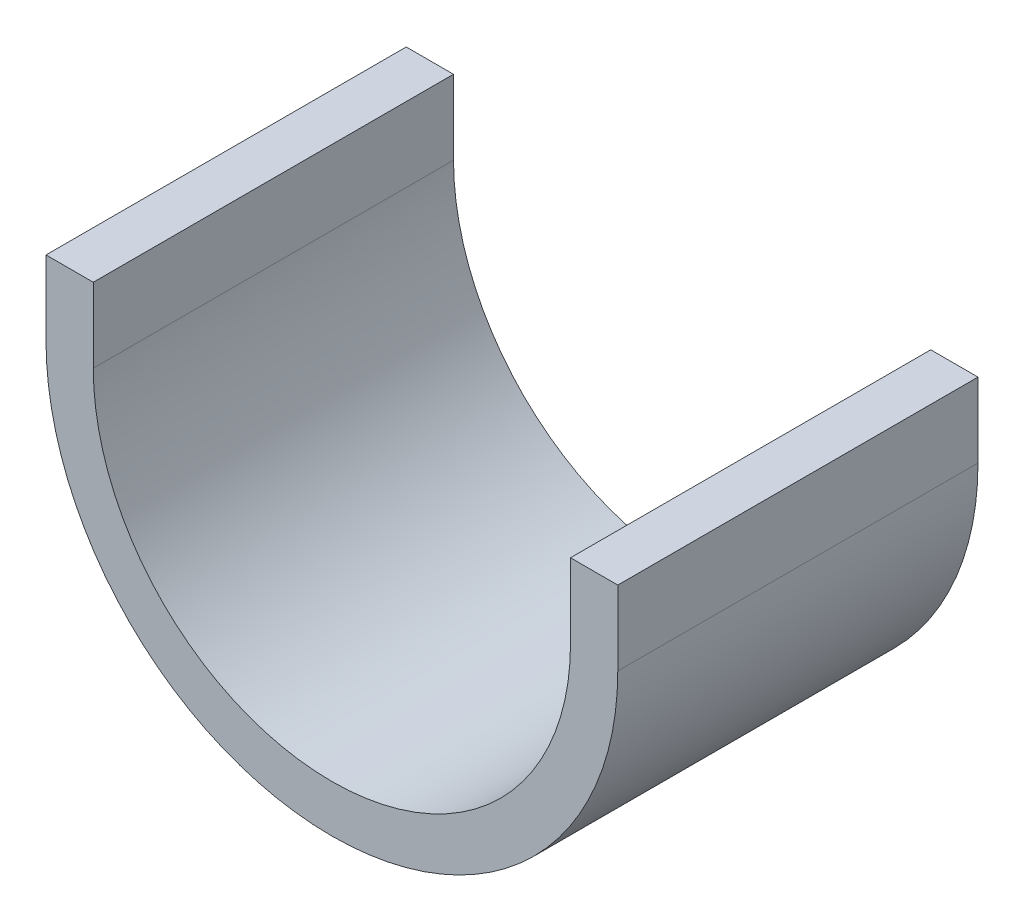
ISO-10303-21;
HEADER;
FILE_DESCRIPTION(('STEP AP214'),'2;1');
FILE_NAME('part.step','',(''),(''),'','','');
FILE_SCHEMA(('AUTOMOTIVE_DESIGN { 1 0 10303 214 1 1 1 1 }'));
ENDSEC;
DATA;
#1=APPLICATION_CONTEXT('core data for automotive mechanical design processes');
#2=APPLICATION_PROTOCOL_DEFINITION('international standard','automotive_design',2000,#1);
#3=PRODUCT_CONTEXT('',#1,'mechanical');
#4=PRODUCT('Part','Part','',(#3));
#5=PRODUCT_RELATED_PRODUCT_CATEGORY('part','',(#4));
#6=PRODUCT_DEFINITION_FORMATION('','',#4);
#7=PRODUCT_DEFINITION_CONTEXT('part definition',#1,'design');
#8=PRODUCT_DEFINITION('design','',#6,#7);
#9=PRODUCT_DEFINITION_SHAPE('','',#8);
#10=(LENGTH_UNIT() NAMED_UNIT(*) SI_UNIT(.MILLI.,.METRE.));
#11=(NAMED_UNIT(*) PLANE_ANGLE_UNIT() SI_UNIT($,.RADIAN.));
#12=(NAMED_UNIT(*) SI_UNIT($,.STERADIAN.) SOLID_ANGLE_UNIT());
#13=UNCERTAINTY_MEASURE_WITH_UNIT(LENGTH_MEASURE(1.E-05),#10,'distance_accuracy_value','');
#14=(GEOMETRIC_REPRESENTATION_CONTEXT(3) GLOBAL_UNCERTAINTY_ASSIGNED_CONTEXT((#13)) GLOBAL_UNIT_ASSIGNED_CONTEXT((#10,
#11,#12)) REPRESENTATION_CONTEXT('',''));
#15=CARTESIAN_POINT('',(0.,0.,0.));
#16=DIRECTION('',(0.,0.,1.));
#17=DIRECTION('',(1.,0.,0.));
#18=AXIS2_PLACEMENT_3D('',#15,#16,#17);
#19=CARTESIAN_POINT('',(64.1050000000003,20.0000000000002,-96.774));
#20=DIRECTION('',(0.,1.,0.));
#21=DIRECTION('',(-1.,0.,0.));
#22=AXIS2_PLACEMENT_3D('',#19,#20,#21);
#23=PLANE('',#22);
#24=DIRECTION('',(-1.,0.,0.));
#25=VECTOR('',#24,1.);
#26=CARTESIAN_POINT('',(64.1050000000003,20.0000000000002,0.));
#27=LINE('',#26,#25);
#28=CARTESIAN_POINT('',(76.8050000000003,20.,0.));
#29=VERTEX_POINT('',#28);
#30=CARTESIAN_POINT('',(64.1050000000003,20.0000000000002,0.));
#31=VERTEX_POINT('',#30);
#32=EDGE_CURVE('E130',#29,#31,#27,.T.);
#33=ORIENTED_EDGE('',*,*,#32,.F.);
#34=DIRECTION('',(0.,0.,1.));
#35=VECTOR('',#34,1.);
#36=CARTESIAN_POINT('',(76.8050000000003,20.,-96.774));
#37=LINE('',#36,#35);
#38=CARTESIAN_POINT('',(76.8050000000003,20.,-96.774));
#39=VERTEX_POINT('',#38);
#40=EDGE_CURVE('E11',#39,#29,#37,.T.);
#41=ORIENTED_EDGE('',*,*,#40,.F.);
#42=DIRECTION('',(-1.,0.,0.));
#43=VECTOR('',#42,1.);
#44=CARTESIAN_POINT('',(64.1050000000003,20.0000000000002,-96.774));
#45=LINE('',#44,#43);
#46=CARTESIAN_POINT('',(64.1050000000003,20.0000000000002,-96.774));
#47=VERTEX_POINT('',#46);
#48=EDGE_CURVE('E150',#39,#47,#45,.T.);
#49=ORIENTED_EDGE('',*,*,#48,.T.);
#50=DIRECTION('',(0.,0.,1.));
#51=VECTOR('',#50,1.);
#52=CARTESIAN_POINT('',(64.1050000000003,20.0000000000002,-96.774));
#53=LINE('',#52,#51);
#54=EDGE_CURVE('E36',#47,#31,#53,.T.);
#55=ORIENTED_EDGE('',*,*,#54,.T.);
#56=EDGE_LOOP('',(#33,#41,#49,#55));
#57=FACE_BOUND('',#56,.T.);
#58=ADVANCED_FACE('F33',(#57),#23,.T.);
#59=CARTESIAN_POINT('',(76.8050000000003,20.,-96.774));
#60=DIRECTION('',(1.,0.,0.));
#61=DIRECTION('',(0.,1.,0.));
#62=AXIS2_PLACEMENT_3D('',#59,#60,#61);
#63=PLANE('',#62);
#64=DIRECTION('',(0.,1.,0.));
#65=VECTOR('',#64,1.);
#66=CARTESIAN_POINT('',(76.8050000000003,20.,0.));
#67=LINE('',#66,#65);
#68=CARTESIAN_POINT('',(76.8050000000003,0.,0.));
#69=VERTEX_POINT('',#68);
#70=EDGE_CURVE('E148',#69,#29,#67,.T.);
#71=ORIENTED_EDGE('',*,*,#70,.F.);
#72=DIRECTION('',(0.,0.,1.));
#73=VECTOR('',#72,1.);
#74=CARTESIAN_POINT('',(76.8050000000003,0.,-96.774));
#75=LINE('',#74,#73);
#76=CARTESIAN_POINT('',(76.8050000000003,0.,-96.774));
#77=VERTEX_POINT('',#76);
#78=EDGE_CURVE('E42',#77,#69,#75,.T.);
#79=ORIENTED_EDGE('',*,*,#78,.F.);
#80=DIRECTION('',(0.,1.,0.));
#81=VECTOR('',#80,1.);
#82=CARTESIAN_POINT('',(76.8050000000003,20.,-96.774));
#83=LINE('',#82,#81);
#84=EDGE_CURVE('E120',#77,#39,#83,.T.);
#85=ORIENTED_EDGE('',*,*,#84,.T.);
#86=ORIENTED_EDGE('',*,*,#40,.T.);
#87=EDGE_LOOP('',(#71,#79,#85,#86));
#88=FACE_BOUND('',#87,.T.);
#89=ADVANCED_FACE('F162',(#88),#63,.T.);
#90=CARTESIAN_POINT('',(0.,0.,-96.774));
#91=DIRECTION('',(0.,0.,1.));
#92=DIRECTION('',(1.,0.,0.));
#93=AXIS2_PLACEMENT_3D('',#90,#91,#92);
#94=CYLINDRICAL_SURFACE('',#93,76.8050000000002);
#95=CARTESIAN_POINT('',(0.,0.,0.));
#96=DIRECTION('',(0.,0.,1.));
#97=DIRECTION('',(1.,0.,0.));
#98=AXIS2_PLACEMENT_3D('',#95,#96,#97);
#99=CIRCLE('',#98,76.8050000000002);
#100=CARTESIAN_POINT('',(-76.8050000000002,0.,0.));
#101=VERTEX_POINT('',#100);
#102=EDGE_CURVE('E107',#101,#69,#99,.T.);
#103=ORIENTED_EDGE('',*,*,#102,.F.);
#104=DIRECTION('',(0.,0.,1.));
#105=VECTOR('',#104,1.);
#106=CARTESIAN_POINT('',(-76.8050000000002,0.,-96.774));
#107=LINE('',#106,#105);
#108=CARTESIAN_POINT('',(-76.8050000000002,0.,-96.774));
#109=VERTEX_POINT('',#108);
#110=EDGE_CURVE('E102',#109,#101,#107,.T.);
#111=ORIENTED_EDGE('',*,*,#110,.F.);
#112=CARTESIAN_POINT('',(0.,0.,-96.774));
#113=DIRECTION('',(0.,0.,1.));
#114=DIRECTION('',(1.,0.,0.));
#115=AXIS2_PLACEMENT_3D('',#112,#113,#114);
#116=CIRCLE('',#115,76.8050000000002);
#117=EDGE_CURVE('E105',#109,#77,#116,.T.);
#118=ORIENTED_EDGE('',*,*,#117,.T.);
#119=ORIENTED_EDGE('',*,*,#78,.T.);
#120=EDGE_LOOP('',(#103,#111,#118,#119));
#121=FACE_BOUND('',#120,.T.);
#122=ADVANCED_FACE('F104',(#121),#94,.T.);
#123=CARTESIAN_POINT('',(-76.8050000000001,0.,-96.774));
#124=DIRECTION('',(-1.,0.,0.));
#125=DIRECTION('',(0.,-1.,0.));
#126=AXIS2_PLACEMENT_3D('',#123,#124,#125);
#127=PLANE('',#126);
#128=DIRECTION('',(0.,-1.,0.));
#129=VECTOR('',#128,1.);
#130=CARTESIAN_POINT('',(-76.8050000000001,0.,0.));
#131=LINE('',#130,#129);
#132=CARTESIAN_POINT('',(-76.8049999999997,20.0000000000002,0.));
#133=VERTEX_POINT('',#132);
#134=EDGE_CURVE('E145',#133,#101,#131,.T.);
#135=ORIENTED_EDGE('',*,*,#134,.F.);
#136=DIRECTION('',(0.,0.,1.));
#137=VECTOR('',#136,1.);
#138=CARTESIAN_POINT('',(-76.8049999999997,20.0000000000002,-96.774));
#139=LINE('',#138,#137);
#140=CARTESIAN_POINT('',(-76.8049999999997,20.0000000000002,-96.774));
#141=VERTEX_POINT('',#140);
#142=EDGE_CURVE('E112',#141,#133,#139,.T.);
#143=ORIENTED_EDGE('',*,*,#142,.F.);
#144=DIRECTION('',(0.,-1.,0.));
#145=VECTOR('',#144,1.);
#146=CARTESIAN_POINT('',(-76.8050000000001,0.,-96.774));
#147=LINE('',#146,#145);
#148=EDGE_CURVE('E118',#141,#109,#147,.T.);
#149=ORIENTED_EDGE('',*,*,#148,.T.);
#150=ORIENTED_EDGE('',*,*,#110,.T.);
#151=EDGE_LOOP('',(#135,#143,#149,#150));
#152=FACE_BOUND('',#151,.T.);
#153=ADVANCED_FACE('F122',(#152),#127,.T.);
#154=CARTESIAN_POINT('',(-76.8049999999997,20.0000000000002,-96.774));
#155=DIRECTION('',(0.,1.,0.));
#156=DIRECTION('',(0.,0.,1.));
#157=AXIS2_PLACEMENT_3D('',#154,#155,#156);
#158=PLANE('',#157);
#159=DIRECTION('',(-1.,0.,0.));
#160=VECTOR('',#159,1.);
#161=CARTESIAN_POINT('',(-76.8049999999997,20.0000000000002,0.));
#162=LINE('',#161,#160);
#163=CARTESIAN_POINT('',(-64.1050000000003,20.0000000000002,0.));
#164=VERTEX_POINT('',#163);
#165=EDGE_CURVE('E142',#164,#133,#162,.T.);
#166=ORIENTED_EDGE('',*,*,#165,.F.);
#167=DIRECTION('',(0.,0.,1.));
#168=VECTOR('',#167,1.);
#169=CARTESIAN_POINT('',(-64.1050000000003,20.0000000000002,-96.774));
#170=LINE('',#169,#168);
#171=CARTESIAN_POINT('',(-64.1050000000003,20.0000000000002,-96.774));
#172=VERTEX_POINT('',#171);
#173=EDGE_CURVE('E154',#172,#164,#170,.T.);
#174=ORIENTED_EDGE('',*,*,#173,.F.);
#175=DIRECTION('',(-1.,0.,0.));
#176=VECTOR('',#175,1.);
#177=CARTESIAN_POINT('',(-76.8049999999997,20.0000000000002,-96.774));
#178=LINE('',#177,#176);
#179=EDGE_CURVE('E123',#172,#141,#178,.T.);
#180=ORIENTED_EDGE('',*,*,#179,.T.);
#181=ORIENTED_EDGE('',*,*,#142,.T.);
#182=EDGE_LOOP('',(#166,#174,#180,#181));
#183=FACE_BOUND('',#182,.T.);
#184=ADVANCED_FACE('F175',(#183),#158,.T.);
#185=CARTESIAN_POINT('',(-64.1050000000003,0.,-96.774));
#186=DIRECTION('',(1.,0.,0.));
#187=DIRECTION('',(0.,0.,-1.));
#188=AXIS2_PLACEMENT_3D('',#185,#186,#187);
#189=PLANE('',#188);
#190=DIRECTION('',(0.,1.,0.));
#191=VECTOR('',#190,1.);
#192=CARTESIAN_POINT('',(-64.1050000000003,0.,0.));
#193=LINE('',#192,#191);
#194=CARTESIAN_POINT('',(-64.1050000000003,0.,0.));
#195=VERTEX_POINT('',#194);
#196=EDGE_CURVE('E139',#195,#164,#193,.T.);
#197=ORIENTED_EDGE('',*,*,#196,.F.);
#198=DIRECTION('',(0.,0.,1.));
#199=VECTOR('',#198,1.);
#200=CARTESIAN_POINT('',(-64.1050000000003,0.,-96.774));
#201=LINE('',#200,#199);
#202=CARTESIAN_POINT('',(-64.1050000000003,0.,-96.774));
#203=VERTEX_POINT('',#202);
#204=EDGE_CURVE('E156',#203,#195,#201,.T.);
#205=ORIENTED_EDGE('',*,*,#204,.F.);
#206=DIRECTION('',(0.,1.,0.));
#207=VECTOR('',#206,1.);
#208=CARTESIAN_POINT('',(-64.1050000000003,0.,-96.774));
#209=LINE('',#208,#207);
#210=EDGE_CURVE('E125',#203,#172,#209,.T.);
#211=ORIENTED_EDGE('',*,*,#210,.T.);
#212=ORIENTED_EDGE('',*,*,#173,.T.);
#213=EDGE_LOOP('',(#197,#205,#211,#212));
#214=FACE_BOUND('',#213,.T.);
#215=ADVANCED_FACE('F178',(#214),#189,.T.);
#216=CARTESIAN_POINT('',(0.,0.,-96.774));
#217=DIRECTION('',(0.,0.,1.));
#218=DIRECTION('',(1.,0.,0.));
#219=AXIS2_PLACEMENT_3D('',#216,#217,#218);
#220=CYLINDRICAL_SURFACE('',#219,64.1050000000003);
#221=CARTESIAN_POINT('',(0.,0.,0.));
#222=DIRECTION('',(0.,0.,-1.));
#223=DIRECTION('',(-1.,0.,0.));
#224=AXIS2_PLACEMENT_3D('',#221,#222,#223);
#225=CIRCLE('',#224,64.1050000000003);
#226=CARTESIAN_POINT('',(64.1050000000003,0.,0.));
#227=VERTEX_POINT('',#226);
#228=EDGE_CURVE('E136',#227,#195,#225,.T.);
#229=ORIENTED_EDGE('',*,*,#228,.F.);
#230=DIRECTION('',(0.,0.,1.));
#231=VECTOR('',#230,1.);
#232=CARTESIAN_POINT('',(64.1050000000003,0.,-96.774));
#233=LINE('',#232,#231);
#234=CARTESIAN_POINT('',(64.1050000000003,0.,-96.774));
#235=VERTEX_POINT('',#234);
#236=EDGE_CURVE('E157',#235,#227,#233,.T.);
#237=ORIENTED_EDGE('',*,*,#236,.F.);
#238=CARTESIAN_POINT('',(0.,0.,-96.774));
#239=DIRECTION('',(0.,0.,-1.));
#240=DIRECTION('',(-1.,0.,0.));
#241=AXIS2_PLACEMENT_3D('',#238,#239,#240);
#242=CIRCLE('',#241,64.1050000000003);
#243=EDGE_CURVE('E253',#235,#203,#242,.T.);
#244=ORIENTED_EDGE('',*,*,#243,.T.);
#245=ORIENTED_EDGE('',*,*,#204,.T.);
#246=EDGE_LOOP('',(#229,#237,#244,#245));
#247=FACE_BOUND('',#246,.T.);
#248=ADVANCED_FACE('F182',(#247),#220,.F.);
#249=CARTESIAN_POINT('',(64.1050000000003,0.,-96.774));
#250=DIRECTION('',(-1.,0.,0.));
#251=DIRECTION('',(0.,0.,1.));
#252=AXIS2_PLACEMENT_3D('',#249,#250,#251);
#253=PLANE('',#252);
#254=DIRECTION('',(0.,-1.,0.));
#255=VECTOR('',#254,1.);
#256=CARTESIAN_POINT('',(64.1050000000003,0.,0.));
#257=LINE('',#256,#255);
#258=EDGE_CURVE('E133',#31,#227,#257,.T.);
#259=ORIENTED_EDGE('',*,*,#258,.F.);
#260=ORIENTED_EDGE('',*,*,#54,.F.);
#261=DIRECTION('',(0.,-1.,0.));
#262=VECTOR('',#261,1.);
#263=CARTESIAN_POINT('',(64.1050000000003,0.,-96.774));
#264=LINE('',#263,#262);
#265=EDGE_CURVE('E254',#47,#235,#264,.T.);
#266=ORIENTED_EDGE('',*,*,#265,.T.);
#267=ORIENTED_EDGE('',*,*,#236,.T.);
#268=EDGE_LOOP('',(#259,#260,#266,#267));
#269=FACE_BOUND('',#268,.T.);
#270=ADVANCED_FACE('F159',(#269),#253,.T.);
#271=CARTESIAN_POINT('',(0.,0.,-96.774));
#272=DIRECTION('',(0.,0.,1.));
#273=DIRECTION('',(1.,0.,0.));
#274=AXIS2_PLACEMENT_3D('',#271,#272,#273);
#275=PLANE('',#274);
#276=ORIENTED_EDGE('',*,*,#48,.F.);
#277=ORIENTED_EDGE('',*,*,#84,.F.);
#278=ORIENTED_EDGE('',*,*,#117,.F.);
#279=ORIENTED_EDGE('',*,*,#148,.F.);
#280=ORIENTED_EDGE('',*,*,#179,.F.);
#281=ORIENTED_EDGE('',*,*,#210,.F.);
#282=ORIENTED_EDGE('',*,*,#243,.F.);
#283=ORIENTED_EDGE('',*,*,#265,.F.);
#284=EDGE_LOOP('',(#276,#277,#278,#279,#280,#281,#282,#283));
#285=FACE_BOUND('',#284,.T.);
#286=ADVANCED_FACE('F116',(#285),#275,.F.);
#287=CARTESIAN_POINT('',(0.,0.,0.));
#288=DIRECTION('',(0.,0.,1.));
#289=DIRECTION('',(1.,0.,0.));
#290=AXIS2_PLACEMENT_3D('',#287,#288,#289);
#291=PLANE('',#290);
#292=ORIENTED_EDGE('',*,*,#32,.T.);
#293=ORIENTED_EDGE('',*,*,#258,.T.);
#294=ORIENTED_EDGE('',*,*,#228,.T.);
#295=ORIENTED_EDGE('',*,*,#196,.T.);
#296=ORIENTED_EDGE('',*,*,#165,.T.);
#297=ORIENTED_EDGE('',*,*,#134,.T.);
#298=ORIENTED_EDGE('',*,*,#102,.T.);
#299=ORIENTED_EDGE('',*,*,#70,.T.);
#300=EDGE_LOOP('',(#292,#293,#294,#295,#296,#297,#298,#299));
#301=FACE_BOUND('',#300,.T.);
#302=ADVANCED_FACE('F161',(#301),#291,.T.);
#303=CLOSED_SHELL('',(#58,#89,#122,#153,#184,#215,#248,#270,#286,#302));
#304=MANIFOLD_SOLID_BREP('B2',#303);
#305=ADVANCED_BREP_SHAPE_REPRESENTATION('',(#18,#304),#14);
#306=SHAPE_DEFINITION_REPRESENTATION(#9,#305);
ENDSEC;
END-ISO-10303-21;
